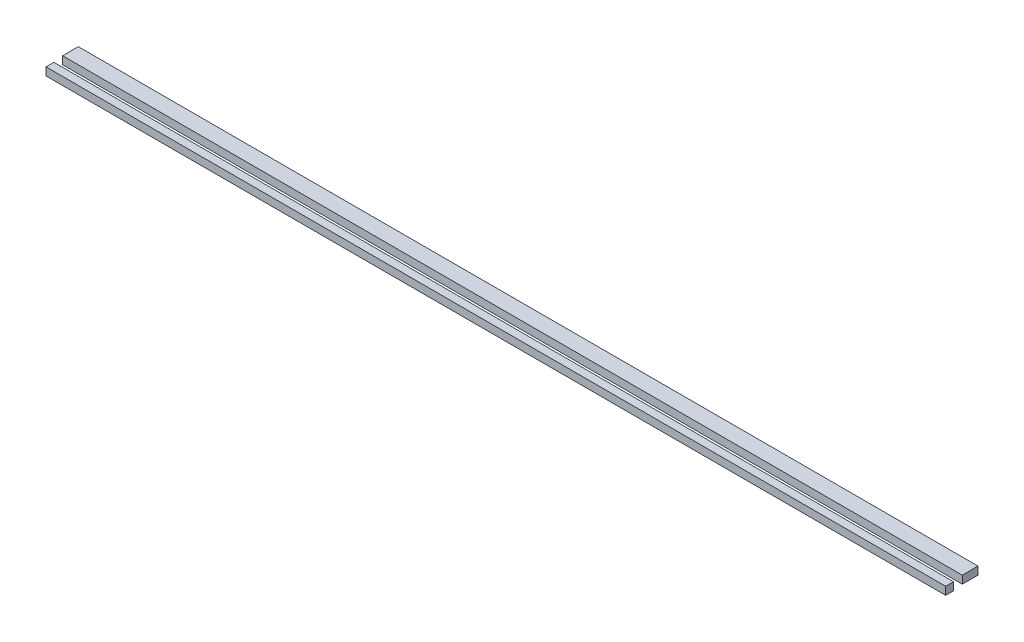
ISO-10303-21;
HEADER;
FILE_DESCRIPTION(('STEP AP214'),'2;1');
FILE_NAME('part.step','',(''),(''),'','','');
FILE_SCHEMA(('AUTOMOTIVE_DESIGN { 1 0 10303 214 1 1 1 1 }'));
ENDSEC;
DATA;
#1=APPLICATION_CONTEXT('core data for automotive mechanical design processes');
#2=APPLICATION_PROTOCOL_DEFINITION('international standard','automotive_design',2000,#1);
#3=PRODUCT_CONTEXT('',#1,'mechanical');
#4=PRODUCT('Part','Part','',(#3));
#5=PRODUCT_RELATED_PRODUCT_CATEGORY('part','',(#4));
#6=PRODUCT_DEFINITION_FORMATION('','',#4);
#7=PRODUCT_DEFINITION_CONTEXT('part definition',#1,'design');
#8=PRODUCT_DEFINITION('design','',#6,#7);
#9=PRODUCT_DEFINITION_SHAPE('','',#8);
#10=(LENGTH_UNIT() NAMED_UNIT(*) SI_UNIT(.MILLI.,.METRE.));
#11=(NAMED_UNIT(*) PLANE_ANGLE_UNIT() SI_UNIT($,.RADIAN.));
#12=(NAMED_UNIT(*) SI_UNIT($,.STERADIAN.) SOLID_ANGLE_UNIT());
#13=UNCERTAINTY_MEASURE_WITH_UNIT(LENGTH_MEASURE(1.E-05),#10,'distance_accuracy_value','');
#14=(GEOMETRIC_REPRESENTATION_CONTEXT(3) GLOBAL_UNCERTAINTY_ASSIGNED_CONTEXT((#13)) GLOBAL_UNIT_ASSIGNED_CONTEXT((#10,
#11,#12)) REPRESENTATION_CONTEXT('',''));
#15=CARTESIAN_POINT('',(0.,0.,0.));
#16=DIRECTION('',(0.,0.,1.));
#17=DIRECTION('',(1.,0.,0.));
#18=AXIS2_PLACEMENT_3D('',#15,#16,#17);
#19=CARTESIAN_POINT('',(-170.042990901024,3.,-89.9715429144929));
#20=DIRECTION('',(1.,0.,0.));
#21=DIRECTION('',(0.,0.,-1.));
#22=AXIS2_PLACEMENT_3D('',#19,#20,#21);
#23=PLANE('',#22);
#24=DIRECTION('',(0.,0.,1.));
#25=VECTOR('',#24,1.);
#26=CARTESIAN_POINT('',(-170.042990901024,0.,-89.9715429144929));
#27=LINE('',#26,#25);
#28=CARTESIAN_POINT('',(-170.042990901024,0.,-89.9715429144929));
#29=VERTEX_POINT('',#28);
#30=CARTESIAN_POINT('',(-170.042990901024,0.,-86.9715429144929));
#31=VERTEX_POINT('',#30);
#32=EDGE_CURVE('E105',#29,#31,#27,.T.);
#33=ORIENTED_EDGE('',*,*,#32,.T.);
#34=DIRECTION('',(0.,-1.,0.));
#35=VECTOR('',#34,1.);
#36=CARTESIAN_POINT('',(-170.042990901024,3.,-86.9715429144929));
#37=LINE('',#36,#35);
#38=CARTESIAN_POINT('',(-170.042990901024,3.,-86.9715429144929));
#39=VERTEX_POINT('',#38);
#40=EDGE_CURVE('E12',#39,#31,#37,.T.);
#41=ORIENTED_EDGE('',*,*,#40,.F.);
#42=DIRECTION('',(0.,0.,1.));
#43=VECTOR('',#42,1.);
#44=CARTESIAN_POINT('',(-170.042990901024,3.,-89.9715429144929));
#45=LINE('',#44,#43);
#46=CARTESIAN_POINT('',(-170.042990901024,3.,-89.9715429144929));
#47=VERTEX_POINT('',#46);
#48=EDGE_CURVE('E93',#47,#39,#45,.T.);
#49=ORIENTED_EDGE('',*,*,#48,.F.);
#50=DIRECTION('',(0.,-1.,0.));
#51=VECTOR('',#50,1.);
#52=CARTESIAN_POINT('',(-170.042990901024,3.,-89.9715429144929));
#53=LINE('',#52,#51);
#54=EDGE_CURVE('E101',#47,#29,#53,.T.);
#55=ORIENTED_EDGE('',*,*,#54,.T.);
#56=EDGE_LOOP('',(#33,#41,#49,#55));
#57=FACE_BOUND('',#56,.T.);
#58=ADVANCED_FACE('F42',(#57),#23,.F.);
#59=CARTESIAN_POINT('',(-170.042990901024,3.,-86.9715429144929));
#60=DIRECTION('',(0.,0.,-1.));
#61=DIRECTION('',(-1.,0.,0.));
#62=AXIS2_PLACEMENT_3D('',#59,#60,#61);
#63=PLANE('',#62);
#64=DIRECTION('',(1.,0.,0.));
#65=VECTOR('',#64,1.);
#66=CARTESIAN_POINT('',(-170.042990901024,0.,-86.9715429144929));
#67=LINE('',#66,#65);
#68=CARTESIAN_POINT('',(172.957009098976,0.,-86.9715429144929));
#69=VERTEX_POINT('',#68);
#70=EDGE_CURVE('E97',#31,#69,#67,.T.);
#71=ORIENTED_EDGE('',*,*,#70,.T.);
#72=DIRECTION('',(0.,-1.,0.));
#73=VECTOR('',#72,1.);
#74=CARTESIAN_POINT('',(172.957009098976,3.,-86.9715429144929));
#75=LINE('',#74,#73);
#76=CARTESIAN_POINT('',(172.957009098976,3.,-86.9715429144929));
#77=VERTEX_POINT('',#76);
#78=EDGE_CURVE('E50',#77,#69,#75,.T.);
#79=ORIENTED_EDGE('',*,*,#78,.F.);
#80=DIRECTION('',(1.,0.,0.));
#81=VECTOR('',#80,1.);
#82=CARTESIAN_POINT('',(-170.042990901024,3.,-86.9715429144929));
#83=LINE('',#82,#81);
#84=EDGE_CURVE('E88',#39,#77,#83,.T.);
#85=ORIENTED_EDGE('',*,*,#84,.F.);
#86=ORIENTED_EDGE('',*,*,#40,.T.);
#87=EDGE_LOOP('',(#71,#79,#85,#86));
#88=FACE_BOUND('',#87,.T.);
#89=ADVANCED_FACE('F96',(#88),#63,.F.);
#90=CARTESIAN_POINT('',(172.957009098976,3.,-89.9715429144929));
#91=DIRECTION('',(-1.,0.,0.));
#92=DIRECTION('',(0.,0.,1.));
#93=AXIS2_PLACEMENT_3D('',#90,#91,#92);
#94=PLANE('',#93);
#95=DIRECTION('',(0.,0.,-1.));
#96=VECTOR('',#95,1.);
#97=CARTESIAN_POINT('',(172.957009098976,0.,-89.9715429144929));
#98=LINE('',#97,#96);
#99=CARTESIAN_POINT('',(172.957009098976,0.,-89.9715429144929));
#100=VERTEX_POINT('',#99);
#101=EDGE_CURVE('E75',#69,#100,#98,.T.);
#102=ORIENTED_EDGE('',*,*,#101,.T.);
#103=DIRECTION('',(0.,-1.,0.));
#104=VECTOR('',#103,1.);
#105=CARTESIAN_POINT('',(172.957009098976,3.,-89.9715429144929));
#106=LINE('',#105,#104);
#107=CARTESIAN_POINT('',(172.957009098976,3.,-89.9715429144929));
#108=VERTEX_POINT('',#107);
#109=EDGE_CURVE('E98',#108,#100,#106,.T.);
#110=ORIENTED_EDGE('',*,*,#109,.F.);
#111=DIRECTION('',(0.,0.,-1.));
#112=VECTOR('',#111,1.);
#113=CARTESIAN_POINT('',(172.957009098976,3.,-89.9715429144929));
#114=LINE('',#113,#112);
#115=EDGE_CURVE('E91',#77,#108,#114,.T.);
#116=ORIENTED_EDGE('',*,*,#115,.F.);
#117=ORIENTED_EDGE('',*,*,#78,.T.);
#118=EDGE_LOOP('',(#102,#110,#116,#117));
#119=FACE_BOUND('',#118,.T.);
#120=ADVANCED_FACE('F99',(#119),#94,.F.);
#121=CARTESIAN_POINT('',(-170.042990901024,3.,-89.9715429144929));
#122=DIRECTION('',(0.,0.,1.));
#123=DIRECTION('',(1.,0.,0.));
#124=AXIS2_PLACEMENT_3D('',#121,#122,#123);
#125=PLANE('',#124);
#126=DIRECTION('',(-1.,0.,0.));
#127=VECTOR('',#126,1.);
#128=CARTESIAN_POINT('',(-170.042990901024,0.,-89.9715429144929));
#129=LINE('',#128,#127);
#130=EDGE_CURVE('E81',#100,#29,#129,.T.);
#131=ORIENTED_EDGE('',*,*,#130,.T.);
#132=ORIENTED_EDGE('',*,*,#54,.F.);
#133=DIRECTION('',(-1.,0.,0.));
#134=VECTOR('',#133,1.);
#135=CARTESIAN_POINT('',(-170.042990901024,3.,-89.9715429144929));
#136=LINE('',#135,#134);
#137=EDGE_CURVE('E58',#108,#47,#136,.T.);
#138=ORIENTED_EDGE('',*,*,#137,.F.);
#139=ORIENTED_EDGE('',*,*,#109,.T.);
#140=EDGE_LOOP('',(#131,#132,#138,#139));
#141=FACE_BOUND('',#140,.T.);
#142=ADVANCED_FACE('F112',(#141),#125,.F.);
#143=CARTESIAN_POINT('',(-37.6173813185546,3.,-50.9531986148584));
#144=DIRECTION('',(0.,1.,0.));
#145=DIRECTION('',(0.,0.,1.));
#146=AXIS2_PLACEMENT_3D('',#143,#144,#145);
#147=PLANE('',#146);
#148=ORIENTED_EDGE('',*,*,#48,.T.);
#149=ORIENTED_EDGE('',*,*,#84,.T.);
#150=ORIENTED_EDGE('',*,*,#115,.T.);
#151=ORIENTED_EDGE('',*,*,#137,.T.);
#152=EDGE_LOOP('',(#148,#149,#150,#151));
#153=FACE_BOUND('',#152,.T.);
#154=ADVANCED_FACE('F89',(#153),#147,.T.);
#155=CARTESIAN_POINT('',(-37.6173813185546,0.,-50.9531986148584));
#156=DIRECTION('',(0.,1.,0.));
#157=DIRECTION('',(0.,0.,1.));
#158=AXIS2_PLACEMENT_3D('',#155,#156,#157);
#159=PLANE('',#158);
#160=ORIENTED_EDGE('',*,*,#32,.F.);
#161=ORIENTED_EDGE('',*,*,#130,.F.);
#162=ORIENTED_EDGE('',*,*,#101,.F.);
#163=ORIENTED_EDGE('',*,*,#70,.F.);
#164=EDGE_LOOP('',(#160,#161,#162,#163));
#165=FACE_BOUND('',#164,.T.);
#166=ADVANCED_FACE('F115',(#165),#159,.F.);
#167=CLOSED_SHELL('',(#58,#89,#120,#142,#154,#166));
#168=MANIFOLD_SOLID_BREP('B2',#167);
#169=CARTESIAN_POINT('',(-170.544035674471,3.,-99.8026755852843));
#170=DIRECTION('',(1.,0.,0.));
#171=DIRECTION('',(0.,0.,-1.));
#172=AXIS2_PLACEMENT_3D('',#169,#170,#171);
#173=PLANE('',#172);
#174=DIRECTION('',(0.,0.,1.));
#175=VECTOR('',#174,1.);
#176=CARTESIAN_POINT('',(-170.544035674471,0.,-99.8026755852843));
#177=LINE('',#176,#175);
#178=CARTESIAN_POINT('',(-170.544035674471,0.,-99.8026755852843));
#179=VERTEX_POINT('',#178);
#180=CARTESIAN_POINT('',(-170.544035674471,0.,-93.8026755852843));
#181=VERTEX_POINT('',#180);
#182=EDGE_CURVE('E228',#179,#181,#177,.T.);
#183=ORIENTED_EDGE('',*,*,#182,.T.);
#184=DIRECTION('',(0.,-1.,0.));
#185=VECTOR('',#184,1.);
#186=CARTESIAN_POINT('',(-170.544035674471,3.,-93.8026755852843));
#187=LINE('',#186,#185);
#188=CARTESIAN_POINT('',(-170.544035674471,3.,-93.8026755852843));
#189=VERTEX_POINT('',#188);
#190=EDGE_CURVE('E40',#189,#181,#187,.T.);
#191=ORIENTED_EDGE('',*,*,#190,.F.);
#192=DIRECTION('',(0.,0.,1.));
#193=VECTOR('',#192,1.);
#194=CARTESIAN_POINT('',(-170.544035674471,3.,-99.8026755852843));
#195=LINE('',#194,#193);
#196=CARTESIAN_POINT('',(-170.544035674471,3.,-99.8026755852843));
#197=VERTEX_POINT('',#196);
#198=EDGE_CURVE('E216',#197,#189,#195,.T.);
#199=ORIENTED_EDGE('',*,*,#198,.F.);
#200=DIRECTION('',(0.,-1.,0.));
#201=VECTOR('',#200,1.);
#202=CARTESIAN_POINT('',(-170.544035674471,3.,-99.8026755852843));
#203=LINE('',#202,#201);
#204=EDGE_CURVE('E224',#197,#179,#203,.T.);
#205=ORIENTED_EDGE('',*,*,#204,.T.);
#206=EDGE_LOOP('',(#183,#191,#199,#205));
#207=FACE_BOUND('',#206,.T.);
#208=ADVANCED_FACE('F165',(#207),#173,.F.);
#209=CARTESIAN_POINT('',(-170.544035674471,3.,-93.8026755852843));
#210=DIRECTION('',(0.,0.,-1.));
#211=DIRECTION('',(-1.,0.,0.));
#212=AXIS2_PLACEMENT_3D('',#209,#210,#211);
#213=PLANE('',#212);
#214=DIRECTION('',(1.,0.,0.));
#215=VECTOR('',#214,1.);
#216=CARTESIAN_POINT('',(-170.544035674471,0.,-93.8026755852843));
#217=LINE('',#216,#215);
#218=CARTESIAN_POINT('',(172.45596432553,0.,-93.8026755852843));
#219=VERTEX_POINT('',#218);
#220=EDGE_CURVE('E220',#181,#219,#217,.T.);
#221=ORIENTED_EDGE('',*,*,#220,.T.);
#222=DIRECTION('',(0.,-1.,0.));
#223=VECTOR('',#222,1.);
#224=CARTESIAN_POINT('',(172.45596432553,3.,-93.8026755852843));
#225=LINE('',#224,#223);
#226=CARTESIAN_POINT('',(172.45596432553,3.,-93.8026755852843));
#227=VERTEX_POINT('',#226);
#228=EDGE_CURVE('E173',#227,#219,#225,.T.);
#229=ORIENTED_EDGE('',*,*,#228,.F.);
#230=DIRECTION('',(1.,0.,0.));
#231=VECTOR('',#230,1.);
#232=CARTESIAN_POINT('',(-170.544035674471,3.,-93.8026755852843));
#233=LINE('',#232,#231);
#234=EDGE_CURVE('E211',#189,#227,#233,.T.);
#235=ORIENTED_EDGE('',*,*,#234,.F.);
#236=ORIENTED_EDGE('',*,*,#190,.T.);
#237=EDGE_LOOP('',(#221,#229,#235,#236));
#238=FACE_BOUND('',#237,.T.);
#239=ADVANCED_FACE('F219',(#238),#213,.F.);
#240=CARTESIAN_POINT('',(172.45596432553,3.,-99.8026755852843));
#241=DIRECTION('',(-1.,0.,0.));
#242=DIRECTION('',(0.,0.,1.));
#243=AXIS2_PLACEMENT_3D('',#240,#241,#242);
#244=PLANE('',#243);
#245=DIRECTION('',(0.,0.,-1.));
#246=VECTOR('',#245,1.);
#247=CARTESIAN_POINT('',(172.45596432553,0.,-99.8026755852843));
#248=LINE('',#247,#246);
#249=CARTESIAN_POINT('',(172.45596432553,0.,-99.8026755852843));
#250=VERTEX_POINT('',#249);
#251=EDGE_CURVE('E198',#219,#250,#248,.T.);
#252=ORIENTED_EDGE('',*,*,#251,.T.);
#253=DIRECTION('',(0.,-1.,0.));
#254=VECTOR('',#253,1.);
#255=CARTESIAN_POINT('',(172.45596432553,3.,-99.8026755852843));
#256=LINE('',#255,#254);
#257=CARTESIAN_POINT('',(172.45596432553,3.,-99.8026755852843));
#258=VERTEX_POINT('',#257);
#259=EDGE_CURVE('E221',#258,#250,#256,.T.);
#260=ORIENTED_EDGE('',*,*,#259,.F.);
#261=DIRECTION('',(0.,0.,-1.));
#262=VECTOR('',#261,1.);
#263=CARTESIAN_POINT('',(172.45596432553,3.,-99.8026755852843));
#264=LINE('',#263,#262);
#265=EDGE_CURVE('E214',#227,#258,#264,.T.);
#266=ORIENTED_EDGE('',*,*,#265,.F.);
#267=ORIENTED_EDGE('',*,*,#228,.T.);
#268=EDGE_LOOP('',(#252,#260,#266,#267));
#269=FACE_BOUND('',#268,.T.);
#270=ADVANCED_FACE('F222',(#269),#244,.F.);
#271=CARTESIAN_POINT('',(-170.544035674471,3.,-99.8026755852843));
#272=DIRECTION('',(0.,0.,1.));
#273=DIRECTION('',(1.,0.,0.));
#274=AXIS2_PLACEMENT_3D('',#271,#272,#273);
#275=PLANE('',#274);
#276=DIRECTION('',(-1.,0.,0.));
#277=VECTOR('',#276,1.);
#278=CARTESIAN_POINT('',(-170.544035674471,0.,-99.8026755852843));
#279=LINE('',#278,#277);
#280=EDGE_CURVE('E204',#250,#179,#279,.T.);
#281=ORIENTED_EDGE('',*,*,#280,.T.);
#282=ORIENTED_EDGE('',*,*,#204,.F.);
#283=DIRECTION('',(-1.,0.,0.));
#284=VECTOR('',#283,1.);
#285=CARTESIAN_POINT('',(-170.544035674471,3.,-99.8026755852843));
#286=LINE('',#285,#284);
#287=EDGE_CURVE('E181',#258,#197,#286,.T.);
#288=ORIENTED_EDGE('',*,*,#287,.F.);
#289=ORIENTED_EDGE('',*,*,#259,.T.);
#290=EDGE_LOOP('',(#281,#282,#288,#289));
#291=FACE_BOUND('',#290,.T.);
#292=ADVANCED_FACE('F235',(#291),#275,.F.);
#293=CARTESIAN_POINT('',(0.,3.,0.));
#294=DIRECTION('',(0.,1.,0.));
#295=DIRECTION('',(0.,0.,1.));
#296=AXIS2_PLACEMENT_3D('',#293,#294,#295);
#297=PLANE('',#296);
#298=ORIENTED_EDGE('',*,*,#198,.T.);
#299=ORIENTED_EDGE('',*,*,#234,.T.);
#300=ORIENTED_EDGE('',*,*,#265,.T.);
#301=ORIENTED_EDGE('',*,*,#287,.T.);
#302=EDGE_LOOP('',(#298,#299,#300,#301));
#303=FACE_BOUND('',#302,.T.);
#304=ADVANCED_FACE('F212',(#303),#297,.T.);
#305=CARTESIAN_POINT('',(0.,0.,0.));
#306=DIRECTION('',(0.,1.,0.));
#307=DIRECTION('',(0.,0.,1.));
#308=AXIS2_PLACEMENT_3D('',#305,#306,#307);
#309=PLANE('',#308);
#310=ORIENTED_EDGE('',*,*,#182,.F.);
#311=ORIENTED_EDGE('',*,*,#280,.F.);
#312=ORIENTED_EDGE('',*,*,#251,.F.);
#313=ORIENTED_EDGE('',*,*,#220,.F.);
#314=EDGE_LOOP('',(#310,#311,#312,#313));
#315=FACE_BOUND('',#314,.T.);
#316=ADVANCED_FACE('F238',(#315),#309,.F.);
#317=CLOSED_SHELL('',(#208,#239,#270,#292,#304,#316));
#318=MANIFOLD_SOLID_BREP('B6',#317);
#319=ADVANCED_BREP_SHAPE_REPRESENTATION('',(#18,#168,#318),#14);
#320=SHAPE_DEFINITION_REPRESENTATION(#9,#319);
ENDSEC;
END-ISO-10303-21;
